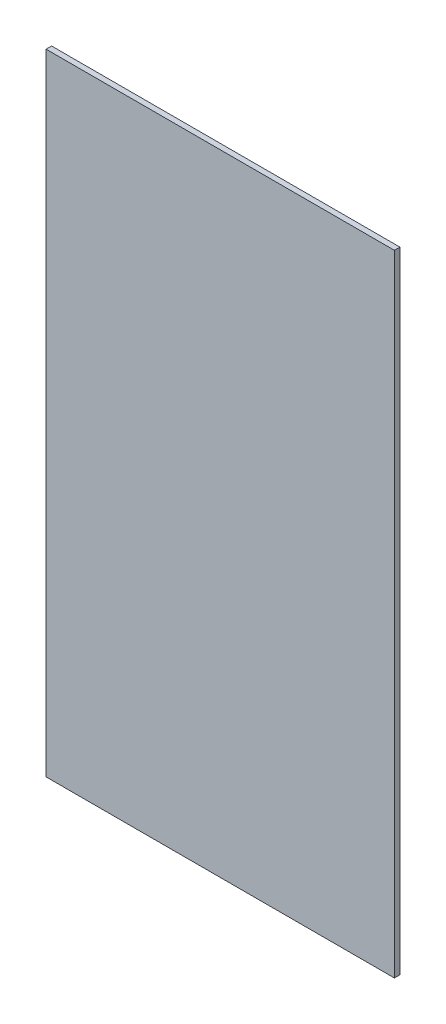
ISO-10303-21;
HEADER;
FILE_DESCRIPTION(('STEP AP214'),'2;1');
FILE_NAME('part.step','',(''),(''),'','','');
FILE_SCHEMA(('AUTOMOTIVE_DESIGN { 1 0 10303 214 1 1 1 1 }'));
ENDSEC;
DATA;
#1=APPLICATION_CONTEXT('core data for automotive mechanical design processes');
#2=APPLICATION_PROTOCOL_DEFINITION('international standard','automotive_design',2000,#1);
#3=PRODUCT_CONTEXT('',#1,'mechanical');
#4=PRODUCT('Part','Part','',(#3));
#5=PRODUCT_RELATED_PRODUCT_CATEGORY('part','',(#4));
#6=PRODUCT_DEFINITION_FORMATION('','',#4);
#7=PRODUCT_DEFINITION_CONTEXT('part definition',#1,'design');
#8=PRODUCT_DEFINITION('design','',#6,#7);
#9=PRODUCT_DEFINITION_SHAPE('','',#8);
#10=(LENGTH_UNIT() NAMED_UNIT(*) SI_UNIT(.MILLI.,.METRE.));
#11=(NAMED_UNIT(*) PLANE_ANGLE_UNIT() SI_UNIT($,.RADIAN.));
#12=(NAMED_UNIT(*) SI_UNIT($,.STERADIAN.) SOLID_ANGLE_UNIT());
#13=UNCERTAINTY_MEASURE_WITH_UNIT(LENGTH_MEASURE(1.E-05),#10,'distance_accuracy_value','');
#14=(GEOMETRIC_REPRESENTATION_CONTEXT(3) GLOBAL_UNCERTAINTY_ASSIGNED_CONTEXT((#13)) GLOBAL_UNIT_ASSIGNED_CONTEXT((#10,
#11,#12)) REPRESENTATION_CONTEXT('',''));
#15=CARTESIAN_POINT('',(0.,0.,0.));
#16=DIRECTION('',(0.,0.,1.));
#17=DIRECTION('',(1.,0.,0.));
#18=AXIS2_PLACEMENT_3D('',#15,#16,#17);
#19=CARTESIAN_POINT('',(-0.31500064,0.56999886,0.));
#20=DIRECTION('',(0.,0.,-1.));
#21=DIRECTION('',(-1.,0.,0.));
#22=AXIS2_PLACEMENT_3D('',#19,#20,#21);
#23=PLANE('',#22);
#24=DIRECTION('',(1.,0.,0.));
#25=VECTOR('',#24,1.);
#26=CARTESIAN_POINT('',(0.31500064,0.56999886,0.));
#27=LINE('',#26,#25);
#28=CARTESIAN_POINT('',(-0.31500064,0.56999886,0.));
#29=VERTEX_POINT('',#28);
#30=CARTESIAN_POINT('',(0.31500064,0.56999886,0.));
#31=VERTEX_POINT('',#30);
#32=EDGE_CURVE('E58',#29,#31,#27,.T.);
#33=ORIENTED_EDGE('',*,*,#32,.T.);
#34=DIRECTION('',(0.,1.,0.));
#35=VECTOR('',#34,1.);
#36=CARTESIAN_POINT('',(0.31500064,-0.56999886,0.));
#37=LINE('',#36,#35);
#38=CARTESIAN_POINT('',(0.31500064,-0.56999886,0.));
#39=VERTEX_POINT('',#38);
#40=EDGE_CURVE('E53',#31,#39,#37,.F.);
#41=ORIENTED_EDGE('',*,*,#40,.T.);
#42=DIRECTION('',(1.,0.,0.));
#43=VECTOR('',#42,1.);
#44=CARTESIAN_POINT('',(-0.31500064,-0.56999886,0.));
#45=LINE('',#44,#43);
#46=CARTESIAN_POINT('',(-0.31500064,-0.56999886,0.));
#47=VERTEX_POINT('',#46);
#48=EDGE_CURVE('E68',#39,#47,#45,.F.);
#49=ORIENTED_EDGE('',*,*,#48,.T.);
#50=DIRECTION('',(0.,1.,0.));
#51=VECTOR('',#50,1.);
#52=CARTESIAN_POINT('',(-0.31500064,0.56999886,0.));
#53=LINE('',#52,#51);
#54=EDGE_CURVE('E20',#47,#29,#53,.T.);
#55=ORIENTED_EDGE('',*,*,#54,.T.);
#56=EDGE_LOOP('',(#33,#41,#49,#55));
#57=FACE_BOUND('',#56,.T.);
#58=ADVANCED_FACE('F17',(#57),#23,.T.);
#59=CARTESIAN_POINT('',(-0.31500064,0.56999886,0.));
#60=DIRECTION('',(1.,0.,0.));
#61=DIRECTION('',(0.,0.,-1.));
#62=AXIS2_PLACEMENT_3D('',#59,#60,#61);
#63=PLANE('',#62);
#64=DIRECTION('',(0.,1.,0.));
#65=VECTOR('',#64,1.);
#66=CARTESIAN_POINT('',(-0.31500064,0.56999886,0.01));
#67=LINE('',#66,#65);
#68=CARTESIAN_POINT('',(-0.31500064,-0.56999886,0.01));
#69=VERTEX_POINT('',#68);
#70=CARTESIAN_POINT('',(-0.31500064,0.56999886,0.01));
#71=VERTEX_POINT('',#70);
#72=EDGE_CURVE('E74',#69,#71,#67,.T.);
#73=ORIENTED_EDGE('',*,*,#72,.T.);
#74=DIRECTION('',(0.,0.,-1.));
#75=VECTOR('',#74,1.);
#76=CARTESIAN_POINT('',(-0.31500064,0.56999886,0.));
#77=LINE('',#76,#75);
#78=EDGE_CURVE('E63',#71,#29,#77,.T.);
#79=ORIENTED_EDGE('',*,*,#78,.T.);
#80=ORIENTED_EDGE('',*,*,#54,.F.);
#81=DIRECTION('',(0.,0.,1.));
#82=VECTOR('',#81,1.);
#83=CARTESIAN_POINT('',(-0.31500064,-0.56999886,0.));
#84=LINE('',#83,#82);
#85=EDGE_CURVE('E80',#47,#69,#84,.T.);
#86=ORIENTED_EDGE('',*,*,#85,.T.);
#87=EDGE_LOOP('',(#73,#79,#80,#86));
#88=FACE_BOUND('',#87,.T.);
#89=ADVANCED_FACE('F73',(#88),#63,.F.);
#90=CARTESIAN_POINT('',(0.31500064,0.56999886,0.));
#91=DIRECTION('',(0.,-1.,0.));
#92=DIRECTION('',(0.,0.,-1.));
#93=AXIS2_PLACEMENT_3D('',#90,#91,#92);
#94=PLANE('',#93);
#95=DIRECTION('',(-1.,0.,0.));
#96=VECTOR('',#95,1.);
#97=CARTESIAN_POINT('',(-0.31500064,0.56999886,0.01));
#98=LINE('',#97,#96);
#99=CARTESIAN_POINT('',(0.31500064,0.56999886,0.01));
#100=VERTEX_POINT('',#99);
#101=EDGE_CURVE('E84',#71,#100,#98,.F.);
#102=ORIENTED_EDGE('',*,*,#101,.T.);
#103=DIRECTION('',(0.,0.,1.));
#104=VECTOR('',#103,1.);
#105=CARTESIAN_POINT('',(0.31500064,0.56999886,0.));
#106=LINE('',#105,#104);
#107=EDGE_CURVE('E65',#100,#31,#106,.F.);
#108=ORIENTED_EDGE('',*,*,#107,.T.);
#109=ORIENTED_EDGE('',*,*,#32,.F.);
#110=ORIENTED_EDGE('',*,*,#78,.F.);
#111=EDGE_LOOP('',(#102,#108,#109,#110));
#112=FACE_BOUND('',#111,.T.);
#113=ADVANCED_FACE('F61',(#112),#94,.F.);
#114=CARTESIAN_POINT('',(0.31500064,-0.56999886,0.));
#115=DIRECTION('',(-1.,0.,0.));
#116=DIRECTION('',(0.,0.,1.));
#117=AXIS2_PLACEMENT_3D('',#114,#115,#116);
#118=PLANE('',#117);
#119=DIRECTION('',(0.,1.,0.));
#120=VECTOR('',#119,1.);
#121=CARTESIAN_POINT('',(0.31500064,0.56999886,0.01));
#122=LINE('',#121,#120);
#123=CARTESIAN_POINT('',(0.31500064,-0.56999886,0.01));
#124=VERTEX_POINT('',#123);
#125=EDGE_CURVE('E26',#100,#124,#122,.F.);
#126=ORIENTED_EDGE('',*,*,#125,.T.);
#127=DIRECTION('',(0.,0.,1.));
#128=VECTOR('',#127,1.);
#129=CARTESIAN_POINT('',(0.31500064,-0.56999886,0.));
#130=LINE('',#129,#128);
#131=EDGE_CURVE('E34',#124,#39,#130,.F.);
#132=ORIENTED_EDGE('',*,*,#131,.T.);
#133=ORIENTED_EDGE('',*,*,#40,.F.);
#134=ORIENTED_EDGE('',*,*,#107,.F.);
#135=EDGE_LOOP('',(#126,#132,#133,#134));
#136=FACE_BOUND('',#135,.T.);
#137=ADVANCED_FACE('F88',(#136),#118,.F.);
#138=CARTESIAN_POINT('',(-0.31500064,-0.56999886,0.));
#139=DIRECTION('',(0.,1.,0.));
#140=DIRECTION('',(0.,0.,1.));
#141=AXIS2_PLACEMENT_3D('',#138,#139,#140);
#142=PLANE('',#141);
#143=DIRECTION('',(-1.,0.,0.));
#144=VECTOR('',#143,1.);
#145=CARTESIAN_POINT('',(-0.31500064,-0.56999886,0.01));
#146=LINE('',#145,#144);
#147=EDGE_CURVE('E11',#124,#69,#146,.T.);
#148=ORIENTED_EDGE('',*,*,#147,.T.);
#149=ORIENTED_EDGE('',*,*,#85,.F.);
#150=ORIENTED_EDGE('',*,*,#48,.F.);
#151=ORIENTED_EDGE('',*,*,#131,.F.);
#152=EDGE_LOOP('',(#148,#149,#150,#151));
#153=FACE_BOUND('',#152,.T.);
#154=ADVANCED_FACE('F91',(#153),#142,.F.);
#155=CARTESIAN_POINT('',(-0.31500064,0.56999886,0.01));
#156=DIRECTION('',(0.,0.,-1.));
#157=DIRECTION('',(-1.,0.,0.));
#158=AXIS2_PLACEMENT_3D('',#155,#156,#157);
#159=PLANE('',#158);
#160=ORIENTED_EDGE('',*,*,#125,.F.);
#161=ORIENTED_EDGE('',*,*,#101,.F.);
#162=ORIENTED_EDGE('',*,*,#72,.F.);
#163=ORIENTED_EDGE('',*,*,#147,.F.);
#164=EDGE_LOOP('',(#160,#161,#162,#163));
#165=FACE_BOUND('',#164,.T.);
#166=ADVANCED_FACE('F90',(#165),#159,.F.);
#167=CLOSED_SHELL('',(#58,#89,#113,#137,#154,#166));
#168=MANIFOLD_SOLID_BREP('B1',#167);
#169=ADVANCED_BREP_SHAPE_REPRESENTATION('',(#18,#168),#14);
#170=SHAPE_DEFINITION_REPRESENTATION(#9,#169);
ENDSEC;
END-ISO-10303-21;
